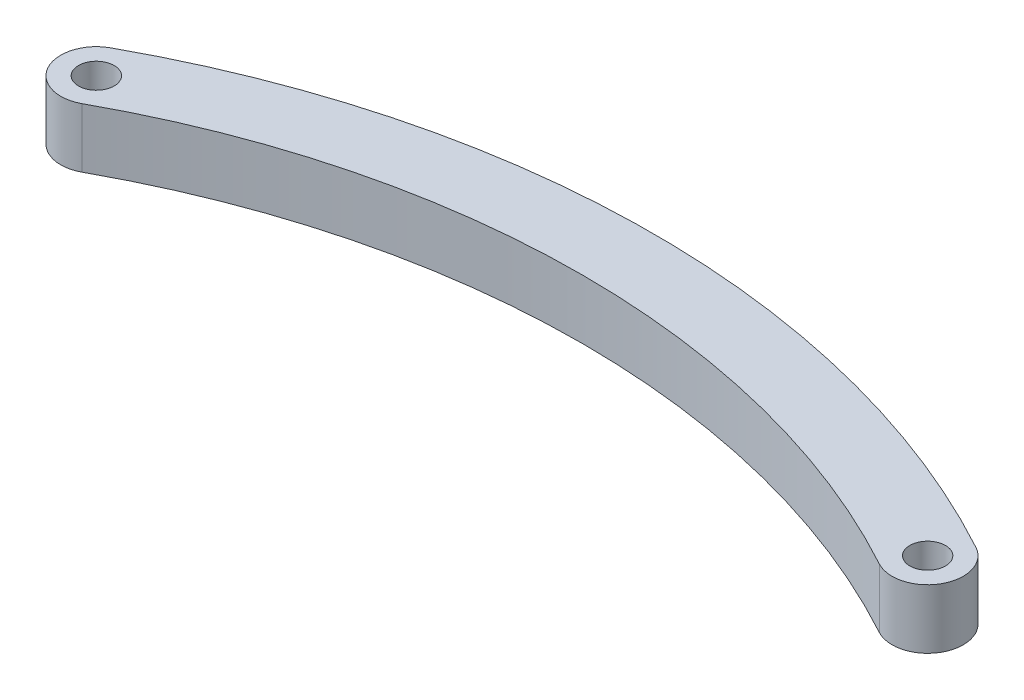
ISO-10303-21;
HEADER;
FILE_DESCRIPTION(('STEP AP214'),'2;1');
FILE_NAME('part.step','',(''),(''),'','','');
FILE_SCHEMA(('AUTOMOTIVE_DESIGN { 1 0 10303 214 1 1 1 1 }'));
ENDSEC;
DATA;
#1=APPLICATION_CONTEXT('core data for automotive mechanical design processes');
#2=APPLICATION_PROTOCOL_DEFINITION('international standard','automotive_design',2000,#1);
#3=PRODUCT_CONTEXT('',#1,'mechanical');
#4=PRODUCT('Part','Part','',(#3));
#5=PRODUCT_RELATED_PRODUCT_CATEGORY('part','',(#4));
#6=PRODUCT_DEFINITION_FORMATION('','',#4);
#7=PRODUCT_DEFINITION_CONTEXT('part definition',#1,'design');
#8=PRODUCT_DEFINITION('design','',#6,#7);
#9=PRODUCT_DEFINITION_SHAPE('','',#8);
#10=(LENGTH_UNIT() NAMED_UNIT(*) SI_UNIT(.MILLI.,.METRE.));
#11=(NAMED_UNIT(*) PLANE_ANGLE_UNIT() SI_UNIT($,.RADIAN.));
#12=(NAMED_UNIT(*) SI_UNIT($,.STERADIAN.) SOLID_ANGLE_UNIT());
#13=UNCERTAINTY_MEASURE_WITH_UNIT(LENGTH_MEASURE(1.E-05),#10,'distance_accuracy_value','');
#14=(GEOMETRIC_REPRESENTATION_CONTEXT(3) GLOBAL_UNCERTAINTY_ASSIGNED_CONTEXT((#13)) GLOBAL_UNIT_ASSIGNED_CONTEXT((#10,
#11,#12)) REPRESENTATION_CONTEXT('',''));
#15=CARTESIAN_POINT('',(0.,0.,0.));
#16=DIRECTION('',(0.,0.,1.));
#17=DIRECTION('',(1.,0.,0.));
#18=AXIS2_PLACEMENT_3D('',#15,#16,#17);
#19=CARTESIAN_POINT('',(0.,5.,64.0624695121879));
#20=DIRECTION('',(0.,-1.,0.));
#21=DIRECTION('',(0.,0.,-1.));
#22=AXIS2_PLACEMENT_3D('',#19,#20,#21);
#23=CYLINDRICAL_SURFACE('',#22,70.);
#24=CARTESIAN_POINT('',(0.,0.,64.0624695121879));
#25=DIRECTION('',(0.,1.,0.));
#26=DIRECTION('',(0.,0.,1.));
#27=AXIS2_PLACEMENT_3D('',#24,#25,#26);
#28=CIRCLE('',#27,70.);
#29=CARTESIAN_POINT('',(33.5616438356164,0.,2.63270422652827));
#30=VERTEX_POINT('',#29);
#31=CARTESIAN_POINT('',(-33.5616438356164,0.,2.63270422652827));
#32=VERTEX_POINT('',#31);
#33=EDGE_CURVE('E104',#30,#32,#28,.T.);
#34=ORIENTED_EDGE('',*,*,#33,.F.);
#35=DIRECTION('',(0.,-1.,0.));
#36=VECTOR('',#35,1.);
#37=CARTESIAN_POINT('',(33.5616438356164,5.,2.63270422652827));
#38=LINE('',#37,#36);
#39=CARTESIAN_POINT('',(33.5616438356164,5.,2.63270422652827));
#40=VERTEX_POINT('',#39);
#41=EDGE_CURVE('E11',#40,#30,#38,.T.);
#42=ORIENTED_EDGE('',*,*,#41,.F.);
#43=CARTESIAN_POINT('',(0.,5.,64.0624695121879));
#44=DIRECTION('',(0.,1.,0.));
#45=DIRECTION('',(0.,0.,1.));
#46=AXIS2_PLACEMENT_3D('',#43,#44,#45);
#47=CIRCLE('',#46,70.);
#48=CARTESIAN_POINT('',(-33.5616438356164,5.,2.63270422652827));
#49=VERTEX_POINT('',#48);
#50=EDGE_CURVE('E86',#40,#49,#47,.T.);
#51=ORIENTED_EDGE('',*,*,#50,.T.);
#52=DIRECTION('',(0.,-1.,0.));
#53=VECTOR('',#52,1.);
#54=CARTESIAN_POINT('',(-33.5616438356164,5.,2.63270422652827));
#55=LINE('',#54,#53);
#56=EDGE_CURVE('E74',#49,#32,#55,.T.);
#57=ORIENTED_EDGE('',*,*,#56,.T.);
#58=EDGE_LOOP('',(#34,#42,#51,#57));
#59=FACE_BOUND('',#58,.T.);
#60=ADVANCED_FACE('F35',(#59),#23,.F.);
#61=CARTESIAN_POINT('',(35.,5.,0.));
#62=DIRECTION('',(0.,-1.,0.));
#63=DIRECTION('',(0.,0.,-1.));
#64=AXIS2_PLACEMENT_3D('',#61,#62,#63);
#65=CYLINDRICAL_SURFACE('',#64,3.);
#66=CARTESIAN_POINT('',(35.,0.,0.));
#67=DIRECTION('',(0.,1.,0.));
#68=DIRECTION('',(0.,0.,1.));
#69=AXIS2_PLACEMENT_3D('',#66,#67,#68);
#70=CIRCLE('',#69,3.);
#71=CARTESIAN_POINT('',(36.4383561643836,0.,-2.63270422652827));
#72=VERTEX_POINT('',#71);
#73=EDGE_CURVE('E91',#30,#72,#70,.T.);
#74=ORIENTED_EDGE('',*,*,#73,.T.);
#75=DIRECTION('',(0.,-1.,0.));
#76=VECTOR('',#75,1.);
#77=CARTESIAN_POINT('',(36.4383561643836,5.,-2.63270422652827));
#78=LINE('',#77,#76);
#79=CARTESIAN_POINT('',(36.4383561643836,5.,-2.63270422652827));
#80=VERTEX_POINT('',#79);
#81=EDGE_CURVE('E43',#80,#72,#78,.T.);
#82=ORIENTED_EDGE('',*,*,#81,.F.);
#83=CARTESIAN_POINT('',(35.,5.,0.));
#84=DIRECTION('',(0.,1.,0.));
#85=DIRECTION('',(0.,0.,1.));
#86=AXIS2_PLACEMENT_3D('',#83,#84,#85);
#87=CIRCLE('',#86,3.);
#88=EDGE_CURVE('E80',#40,#80,#87,.T.);
#89=ORIENTED_EDGE('',*,*,#88,.F.);
#90=ORIENTED_EDGE('',*,*,#41,.T.);
#91=EDGE_LOOP('',(#74,#82,#89,#90));
#92=FACE_BOUND('',#91,.T.);
#93=ADVANCED_FACE('F89',(#92),#65,.T.);
#94=CARTESIAN_POINT('',(0.,5.,64.0624695121879));
#95=DIRECTION('',(0.,-1.,0.));
#96=DIRECTION('',(0.,0.,-1.));
#97=AXIS2_PLACEMENT_3D('',#94,#95,#96);
#98=CYLINDRICAL_SURFACE('',#97,76.);
#99=CARTESIAN_POINT('',(0.,0.,64.0624695121879));
#100=DIRECTION('',(0.,1.,0.));
#101=DIRECTION('',(0.,0.,1.));
#102=AXIS2_PLACEMENT_3D('',#99,#100,#101);
#103=CIRCLE('',#102,76.);
#104=CARTESIAN_POINT('',(-36.4383561643836,0.,-2.63270422652827));
#105=VERTEX_POINT('',#104);
#106=EDGE_CURVE('E67',#72,#105,#103,.T.);
#107=ORIENTED_EDGE('',*,*,#106,.T.);
#108=DIRECTION('',(0.,-1.,0.));
#109=VECTOR('',#108,1.);
#110=CARTESIAN_POINT('',(-36.4383561643836,5.,-2.63270422652827));
#111=LINE('',#110,#109);
#112=CARTESIAN_POINT('',(-36.4383561643836,5.,-2.63270422652827));
#113=VERTEX_POINT('',#112);
#114=EDGE_CURVE('E92',#113,#105,#111,.T.);
#115=ORIENTED_EDGE('',*,*,#114,.F.);
#116=CARTESIAN_POINT('',(0.,5.,64.0624695121879));
#117=DIRECTION('',(0.,1.,0.));
#118=DIRECTION('',(0.,0.,1.));
#119=AXIS2_PLACEMENT_3D('',#116,#117,#118);
#120=CIRCLE('',#119,76.);
#121=EDGE_CURVE('E85',#80,#113,#120,.T.);
#122=ORIENTED_EDGE('',*,*,#121,.F.);
#123=ORIENTED_EDGE('',*,*,#81,.T.);
#124=EDGE_LOOP('',(#107,#115,#122,#123));
#125=FACE_BOUND('',#124,.T.);
#126=ADVANCED_FACE('F93',(#125),#98,.T.);
#127=CARTESIAN_POINT('',(-35.,5.,0.));
#128=DIRECTION('',(0.,-1.,0.));
#129=DIRECTION('',(0.,0.,-1.));
#130=AXIS2_PLACEMENT_3D('',#127,#128,#129);
#131=CYLINDRICAL_SURFACE('',#130,1.5);
#132=CARTESIAN_POINT('',(-35.,5.,0.));
#133=DIRECTION('',(0.,1.,0.));
#134=DIRECTION('',(0.,0.,1.));
#135=AXIS2_PLACEMENT_3D('',#132,#133,#134);
#136=CIRCLE('',#135,1.5);
#137=CARTESIAN_POINT('',(-35.,5.,1.5));
#138=VERTEX_POINT('',#137);
#139=EDGE_CURVE('E95',#138,#138,#136,.T.);
#140=ORIENTED_EDGE('',*,*,#139,.T.);
#141=EDGE_LOOP('',(#140));
#142=FACE_BOUND('',#141,.T.);
#143=CARTESIAN_POINT('',(-35.,0.,0.));
#144=DIRECTION('',(0.,1.,0.));
#145=DIRECTION('',(0.,0.,1.));
#146=AXIS2_PLACEMENT_3D('',#143,#144,#145);
#147=CIRCLE('',#146,1.5);
#148=CARTESIAN_POINT('',(-35.,0.,1.5));
#149=VERTEX_POINT('',#148);
#150=EDGE_CURVE('E111',#149,#149,#147,.T.);
#151=ORIENTED_EDGE('',*,*,#150,.F.);
#152=EDGE_LOOP('',(#151));
#153=FACE_BOUND('',#152,.T.);
#154=ADVANCED_FACE('F131',(#142,#153),#131,.F.);
#155=CARTESIAN_POINT('',(-35.,5.,0.));
#156=DIRECTION('',(0.,-1.,0.));
#157=DIRECTION('',(0.,0.,-1.));
#158=AXIS2_PLACEMENT_3D('',#155,#156,#157);
#159=CYLINDRICAL_SURFACE('',#158,3.);
#160=CARTESIAN_POINT('',(-35.,0.,0.));
#161=DIRECTION('',(0.,1.,0.));
#162=DIRECTION('',(0.,0.,1.));
#163=AXIS2_PLACEMENT_3D('',#160,#161,#162);
#164=CIRCLE('',#163,3.);
#165=EDGE_CURVE('E109',#105,#32,#164,.T.);
#166=ORIENTED_EDGE('',*,*,#165,.T.);
#167=ORIENTED_EDGE('',*,*,#56,.F.);
#168=CARTESIAN_POINT('',(-35.,5.,0.));
#169=DIRECTION('',(0.,1.,0.));
#170=DIRECTION('',(0.,0.,1.));
#171=AXIS2_PLACEMENT_3D('',#168,#169,#170);
#172=CIRCLE('',#171,3.);
#173=EDGE_CURVE('E51',#113,#49,#172,.T.);
#174=ORIENTED_EDGE('',*,*,#173,.F.);
#175=ORIENTED_EDGE('',*,*,#114,.T.);
#176=EDGE_LOOP('',(#166,#167,#174,#175));
#177=FACE_BOUND('',#176,.T.);
#178=ADVANCED_FACE('F120',(#177),#159,.T.);
#179=CARTESIAN_POINT('',(35.,5.,0.));
#180=DIRECTION('',(0.,-1.,0.));
#181=DIRECTION('',(0.,0.,-1.));
#182=AXIS2_PLACEMENT_3D('',#179,#180,#181);
#183=CYLINDRICAL_SURFACE('',#182,1.5);
#184=CARTESIAN_POINT('',(35.,5.,0.));
#185=DIRECTION('',(0.,1.,0.));
#186=DIRECTION('',(0.,0.,1.));
#187=AXIS2_PLACEMENT_3D('',#184,#185,#186);
#188=CIRCLE('',#187,1.5);
#189=CARTESIAN_POINT('',(35.,5.,1.5));
#190=VERTEX_POINT('',#189);
#191=EDGE_CURVE('E101',#190,#190,#188,.T.);
#192=ORIENTED_EDGE('',*,*,#191,.T.);
#193=EDGE_LOOP('',(#192));
#194=FACE_BOUND('',#193,.T.);
#195=CARTESIAN_POINT('',(35.,0.,0.));
#196=DIRECTION('',(0.,1.,0.));
#197=DIRECTION('',(0.,0.,1.));
#198=AXIS2_PLACEMENT_3D('',#195,#196,#197);
#199=CIRCLE('',#198,1.5);
#200=CARTESIAN_POINT('',(35.,0.,1.5));
#201=VERTEX_POINT('',#200);
#202=EDGE_CURVE('E114',#201,#201,#199,.T.);
#203=ORIENTED_EDGE('',*,*,#202,.F.);
#204=EDGE_LOOP('',(#203));
#205=FACE_BOUND('',#204,.T.);
#206=ADVANCED_FACE('F136',(#194,#205),#183,.F.);
#207=CARTESIAN_POINT('',(0.,5.,0.));
#208=DIRECTION('',(0.,1.,0.));
#209=DIRECTION('',(0.,0.,1.));
#210=AXIS2_PLACEMENT_3D('',#207,#208,#209);
#211=PLANE('',#210);
#212=ORIENTED_EDGE('',*,*,#50,.F.);
#213=ORIENTED_EDGE('',*,*,#88,.T.);
#214=ORIENTED_EDGE('',*,*,#121,.T.);
#215=ORIENTED_EDGE('',*,*,#173,.T.);
#216=EDGE_LOOP('',(#212,#213,#214,#215));
#217=FACE_BOUND('',#216,.T.);
#218=ORIENTED_EDGE('',*,*,#139,.F.);
#219=EDGE_LOOP('',(#218));
#220=FACE_BOUND('',#219,.T.);
#221=ORIENTED_EDGE('',*,*,#191,.F.);
#222=EDGE_LOOP('',(#221));
#223=FACE_BOUND('',#222,.T.);
#224=ADVANCED_FACE('F82',(#217,#220,#223),#211,.T.);
#225=CARTESIAN_POINT('',(0.,0.,0.));
#226=DIRECTION('',(0.,1.,0.));
#227=DIRECTION('',(0.,0.,1.));
#228=AXIS2_PLACEMENT_3D('',#225,#226,#227);
#229=PLANE('',#228);
#230=ORIENTED_EDGE('',*,*,#33,.T.);
#231=ORIENTED_EDGE('',*,*,#165,.F.);
#232=ORIENTED_EDGE('',*,*,#106,.F.);
#233=ORIENTED_EDGE('',*,*,#73,.F.);
#234=EDGE_LOOP('',(#230,#231,#232,#233));
#235=FACE_BOUND('',#234,.T.);
#236=ORIENTED_EDGE('',*,*,#150,.T.);
#237=EDGE_LOOP('',(#236));
#238=FACE_BOUND('',#237,.T.);
#239=ORIENTED_EDGE('',*,*,#202,.T.);
#240=EDGE_LOOP('',(#239));
#241=FACE_BOUND('',#240,.T.);
#242=ADVANCED_FACE('F122',(#235,#238,#241),#229,.F.);
#243=CLOSED_SHELL('',(#60,#93,#126,#154,#178,#206,#224,#242));
#244=MANIFOLD_SOLID_BREP('B2',#243);
#245=ADVANCED_BREP_SHAPE_REPRESENTATION('',(#18,#244),#14);
#246=SHAPE_DEFINITION_REPRESENTATION(#9,#245);
ENDSEC;
END-ISO-10303-21;
